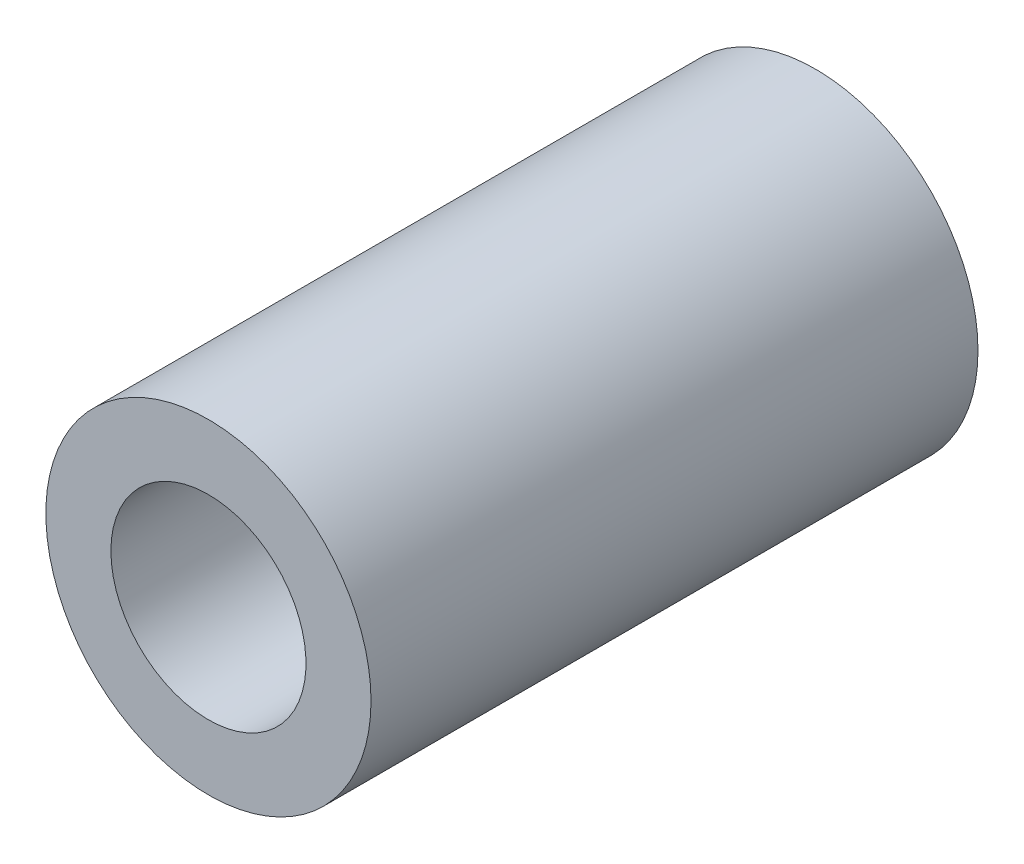
ISO-10303-21;
HEADER;
FILE_DESCRIPTION(('STEP AP214'),'2;1');
FILE_NAME('part.step','',(''),(''),'','','');
FILE_SCHEMA(('AUTOMOTIVE_DESIGN { 1 0 10303 214 1 1 1 1 }'));
ENDSEC;
DATA;
#1=APPLICATION_CONTEXT('core data for automotive mechanical design processes');
#2=APPLICATION_PROTOCOL_DEFINITION('international standard','automotive_design',2000,#1);
#3=PRODUCT_CONTEXT('',#1,'mechanical');
#4=PRODUCT('Part','Part','',(#3));
#5=PRODUCT_RELATED_PRODUCT_CATEGORY('part','',(#4));
#6=PRODUCT_DEFINITION_FORMATION('','',#4);
#7=PRODUCT_DEFINITION_CONTEXT('part definition',#1,'design');
#8=PRODUCT_DEFINITION('design','',#6,#7);
#9=PRODUCT_DEFINITION_SHAPE('','',#8);
#10=(LENGTH_UNIT() NAMED_UNIT(*) SI_UNIT(.MILLI.,.METRE.));
#11=(NAMED_UNIT(*) PLANE_ANGLE_UNIT() SI_UNIT($,.RADIAN.));
#12=(NAMED_UNIT(*) SI_UNIT($,.STERADIAN.) SOLID_ANGLE_UNIT());
#13=UNCERTAINTY_MEASURE_WITH_UNIT(LENGTH_MEASURE(1.E-05),#10,'distance_accuracy_value','');
#14=(GEOMETRIC_REPRESENTATION_CONTEXT(3) GLOBAL_UNCERTAINTY_ASSIGNED_CONTEXT((#13)) GLOBAL_UNIT_ASSIGNED_CONTEXT((#10,
#11,#12)) REPRESENTATION_CONTEXT('',''));
#15=CARTESIAN_POINT('',(0.,0.,0.));
#16=DIRECTION('',(0.,0.,1.));
#17=DIRECTION('',(1.,0.,0.));
#18=AXIS2_PLACEMENT_3D('',#15,#16,#17);
#19=CARTESIAN_POINT('',(-14.5000000000002,-25.1147367097487,49.9999999999545));
#20=DIRECTION('',(0.,0.,1.));
#21=DIRECTION('',(1.,0.,0.));
#22=AXIS2_PLACEMENT_3D('',#19,#20,#21);
#23=CONICAL_SURFACE('',#22,2.50000000000836,0.67474094227567);
#24=CARTESIAN_POINT('',(-14.5000000000002,-25.1147367097487,49.5000000000232));
#25=DIRECTION('',(0.,0.,-1.));
#26=DIRECTION('',(0.500000000007468,-0.866025403780127,0.));
#27=AXIS2_PLACEMENT_3D('',#24,#25,#26);
#28=CIRCLE('',#27,2.09999999995712);
#29=CARTESIAN_POINT('',(-13.450000000006,-26.9333900576498,49.5000000000232));
#30=VERTEX_POINT('',#29);
#31=EDGE_CURVE('E93',#30,#30,#28,.T.);
#32=ORIENTED_EDGE('',*,*,#31,.T.);
#33=EDGE_LOOP('',(#32));
#34=FACE_BOUND('',#33,.T.);
#35=CARTESIAN_POINT('',(-14.5000000000002,-25.1147367097487,49.9999999999545));
#36=DIRECTION('',(0.,0.,-1.));
#37=DIRECTION('',(0.499999999997362,-0.866025403785962,0.));
#38=AXIS2_PLACEMENT_3D('',#35,#36,#37);
#39=CIRCLE('',#38,2.5000000000718);
#40=CARTESIAN_POINT('',(-13.2499999999709,-27.2798002192758,49.9999999999545));
#41=VERTEX_POINT('',#40);
#42=EDGE_CURVE('E88',#41,#41,#39,.F.);
#43=ORIENTED_EDGE('',*,*,#42,.T.);
#44=EDGE_LOOP('',(#43));
#45=FACE_BOUND('',#44,.T.);
#46=ADVANCED_FACE('F15',(#34,#45),#23,.F.);
#47=CARTESIAN_POINT('',(-14.5000000000002,-25.1147367097487,49.000000000035));
#48=DIRECTION('',(0.,0.,-1.));
#49=DIRECTION('',(-1.,0.,0.));
#50=AXIS2_PLACEMENT_3D('',#47,#48,#49);
#51=CONICAL_SURFACE('',#50,2.49999999994492,0.674740942259449);
#52=CARTESIAN_POINT('',(-14.5000000000002,-25.1147367097487,49.000000000035));
#53=DIRECTION('',(0.,0.,1.));
#54=DIRECTION('',(0.499999999998681,-0.8660254037852,0.));
#55=AXIS2_PLACEMENT_3D('',#52,#53,#54);
#56=CIRCLE('',#55,2.50000000000836);
#57=CARTESIAN_POINT('',(-13.2499999999993,-27.2798002192189,49.000000000035));
#58=VERTEX_POINT('',#57);
#59=EDGE_CURVE('E83',#58,#58,#56,.F.);
#60=ORIENTED_EDGE('',*,*,#59,.T.);
#61=EDGE_LOOP('',(#60));
#62=FACE_BOUND('',#61,.T.);
#63=ORIENTED_EDGE('',*,*,#31,.F.);
#64=EDGE_LOOP('',(#63));
#65=FACE_BOUND('',#64,.T.);
#66=ADVANCED_FACE('F100',(#62,#65),#51,.F.);
#67=CARTESIAN_POINT('',(-14.5000000000002,-25.1147367097487,49.9999999999545));
#68=DIRECTION('',(0.,0.,-1.));
#69=DIRECTION('',(-1.,0.,0.));
#70=AXIS2_PLACEMENT_3D('',#67,#68,#69);
#71=CONICAL_SURFACE('',#70,2.5000000000718,0.674740942225901);
#72=ORIENTED_EDGE('',*,*,#42,.F.);
#73=EDGE_LOOP('',(#72));
#74=FACE_BOUND('',#73,.T.);
#75=CARTESIAN_POINT('',(-14.5000000000002,-25.1147367097487,50.4999999999427));
#76=DIRECTION('',(0.,0.,1.));
#77=DIRECTION('',(0.500000000007468,-0.866025403780127,0.));
#78=AXIS2_PLACEMENT_3D('',#75,#76,#77);
#79=CIRCLE('',#78,2.09999999995712);
#80=CARTESIAN_POINT('',(-13.450000000006,-26.9333900576498,50.4999999999427));
#81=VERTEX_POINT('',#80);
#82=EDGE_CURVE('E78',#81,#81,#79,.T.);
#83=ORIENTED_EDGE('',*,*,#82,.T.);
#84=EDGE_LOOP('',(#83));
#85=FACE_BOUND('',#84,.T.);
#86=ADVANCED_FACE('F102',(#74,#85),#71,.F.);
#87=CARTESIAN_POINT('',(-14.5000000000002,-25.1147367097487,48.9999999999213));
#88=DIRECTION('',(0.,0.,1.));
#89=DIRECTION('',(1.,0.,0.));
#90=AXIS2_PLACEMENT_3D('',#87,#88,#89);
#91=CONICAL_SURFACE('',#90,2.49999999994492,0.67474094224212);
#92=CARTESIAN_POINT('',(-14.5000000000002,-25.1147367097487,48.4999999999332));
#93=DIRECTION('',(0.,0.,-1.));
#94=DIRECTION('',(0.500000000005898,-0.866025403781034,0.));
#95=AXIS2_PLACEMENT_3D('',#92,#93,#94);
#96=CIRCLE('',#95,2.10000000002056);
#97=CARTESIAN_POINT('',(-13.4499999999775,-26.9333900577067,48.4999999999332));
#98=VERTEX_POINT('',#97);
#99=EDGE_CURVE('E73',#98,#98,#96,.T.);
#100=ORIENTED_EDGE('',*,*,#99,.T.);
#101=EDGE_LOOP('',(#100));
#102=FACE_BOUND('',#101,.T.);
#103=ORIENTED_EDGE('',*,*,#59,.F.);
#104=EDGE_LOOP('',(#103));
#105=FACE_BOUND('',#104,.T.);
#106=ADVANCED_FACE('F110',(#102,#105),#91,.F.);
#107=CARTESIAN_POINT('',(-14.5000000000002,-25.1147367097487,50.9999999999309));
#108=DIRECTION('',(0.,0.,1.));
#109=DIRECTION('',(1.,0.,0.));
#110=AXIS2_PLACEMENT_3D('',#107,#108,#109);
#111=CONICAL_SURFACE('',#110,2.49999999994492,0.674740942259449);
#112=ORIENTED_EDGE('',*,*,#82,.F.);
#113=EDGE_LOOP('',(#112));
#114=FACE_BOUND('',#113,.T.);
#115=CARTESIAN_POINT('',(-14.5000000000002,-25.1147367097487,50.9999999999309));
#116=DIRECTION('',(0.,0.,-1.));
#117=DIRECTION('',(0.500000000007207,-0.866025403780278,0.));
#118=AXIS2_PLACEMENT_3D('',#115,#116,#117);
#119=CIRCLE('',#118,2.50000000002257);
#120=CARTESIAN_POINT('',(-13.2499999999709,-27.2798002192189,50.9999999999309));
#121=VERTEX_POINT('',#120);
#122=EDGE_CURVE('E68',#121,#121,#119,.F.);
#123=ORIENTED_EDGE('',*,*,#122,.T.);
#124=EDGE_LOOP('',(#123));
#125=FACE_BOUND('',#124,.T.);
#126=ADVANCED_FACE('F162',(#114,#125),#111,.F.);
#127=CARTESIAN_POINT('',(-14.5000000000002,-25.1147367097487,48.0000000000587));
#128=DIRECTION('',(0.,0.,-1.));
#129=DIRECTION('',(-1.,0.,0.));
#130=AXIS2_PLACEMENT_3D('',#127,#128,#129);
#131=CONICAL_SURFACE('',#130,2.49999999989569,0.67474094217751);
#132=CARTESIAN_POINT('',(-14.5000000000002,-25.1147367097487,48.0000000000018));
#133=DIRECTION('',(0.,0.,1.));
#134=DIRECTION('',(0.5,-0.866025403784439,0.));
#135=AXIS2_PLACEMENT_3D('',#132,#133,#134);
#136=CIRCLE('',#135,2.49999999994493);
#137=CARTESIAN_POINT('',(-13.2500000000277,-27.2798002191621,48.0000000000018));
#138=VERTEX_POINT('',#137);
#139=EDGE_CURVE('E63',#138,#138,#136,.F.);
#140=ORIENTED_EDGE('',*,*,#139,.T.);
#141=EDGE_LOOP('',(#140));
#142=FACE_BOUND('',#141,.T.);
#143=ORIENTED_EDGE('',*,*,#99,.F.);
#144=EDGE_LOOP('',(#143));
#145=FACE_BOUND('',#144,.T.);
#146=ADVANCED_FACE('F158',(#142,#145),#131,.F.);
#147=CARTESIAN_POINT('',(-14.5000000000002,-25.1147367097487,50.9999999999309));
#148=DIRECTION('',(0.,0.,-1.));
#149=DIRECTION('',(-1.,0.,0.));
#150=AXIS2_PLACEMENT_3D('',#147,#148,#149);
#151=CONICAL_SURFACE('',#150,2.50000000002257,0.67474094224212);
#152=ORIENTED_EDGE('',*,*,#122,.F.);
#153=EDGE_LOOP('',(#152));
#154=FACE_BOUND('',#153,.T.);
#155=CARTESIAN_POINT('',(-14.5000000000002,-25.1147367097487,51.4999999999759));
#156=DIRECTION('',(0.,0.,1.));
#157=DIRECTION('',(0.499999999997318,-0.866025403785987,0.));
#158=AXIS2_PLACEMENT_3D('',#155,#156,#157);
#159=CIRCLE('',#158,2.09999999994291);
#160=CARTESIAN_POINT('',(-13.4500000000344,-26.9333900576498,51.4999999999759));
#161=VERTEX_POINT('',#160);
#162=EDGE_CURVE('E58',#161,#161,#159,.T.);
#163=ORIENTED_EDGE('',*,*,#162,.T.);
#164=EDGE_LOOP('',(#163));
#165=FACE_BOUND('',#164,.T.);
#166=ADVANCED_FACE('F154',(#154,#165),#151,.F.);
#167=CARTESIAN_POINT('',(-14.5000000000002,-25.1147367097487,48.0000000000018));
#168=DIRECTION('',(0.,0.,1.));
#169=DIRECTION('',(1.,0.,0.));
#170=AXIS2_PLACEMENT_3D('',#167,#168,#169);
#171=CONICAL_SURFACE('',#170,2.49999999994492,0.674740942215636);
#172=CARTESIAN_POINT('',(-14.5000000000002,-25.1147367097487,47.5000000000136));
#173=DIRECTION('',(0.,0.,-1.));
#174=DIRECTION('',(0.499999999995747,-0.866025403786894,0.));
#175=AXIS2_PLACEMENT_3D('',#172,#173,#174);
#176=CIRCLE('',#175,2.10000000000635);
#177=CARTESIAN_POINT('',(-13.450000000006,-26.9333900577067,47.5000000000136));
#178=VERTEX_POINT('',#177);
#179=EDGE_CURVE('E50',#178,#178,#176,.T.);
#180=ORIENTED_EDGE('',*,*,#179,.T.);
#181=EDGE_LOOP('',(#180));
#182=FACE_BOUND('',#181,.T.);
#183=ORIENTED_EDGE('',*,*,#139,.F.);
#184=EDGE_LOOP('',(#183));
#185=FACE_BOUND('',#184,.T.);
#186=ADVANCED_FACE('F150',(#182,#185),#171,.F.);
#187=CARTESIAN_POINT('',(-14.5000000000002,-25.1147367097487,52.0000000000209));
#188=DIRECTION('',(0.,0.,1.));
#189=DIRECTION('',(1.,0.,0.));
#190=AXIS2_PLACEMENT_3D('',#187,#188,#189);
#191=CONICAL_SURFACE('',#190,2.49999999999415,0.67474094224212);
#192=ORIENTED_EDGE('',*,*,#162,.F.);
#193=EDGE_LOOP('',(#192));
#194=FACE_BOUND('',#193,.T.);
#195=CARTESIAN_POINT('',(-14.5000000000002,-25.1147367097487,52.0000000000209));
#196=DIRECTION('',(0.,0.,1.));
#197=DIRECTION('',(1.,0.,0.));
#198=AXIS2_PLACEMENT_3D('',#195,#196,#197);
#199=CIRCLE('',#198,2.49999999999415);
#200=CARTESIAN_POINT('',(-12.0000000000061,-25.1147367097487,52.0000000000209));
#201=VERTEX_POINT('',#200);
#202=EDGE_CURVE('E18',#201,#201,#199,.F.);
#203=ORIENTED_EDGE('',*,*,#202,.F.);
#204=EDGE_LOOP('',(#203));
#205=FACE_BOUND('',#204,.T.);
#206=ADVANCED_FACE('F147',(#194,#205),#191,.F.);
#207=CARTESIAN_POINT('',(-14.5000000000002,-25.1147367097487,46.9999999999686));
#208=DIRECTION('',(0.,0.,-1.));
#209=DIRECTION('',(-1.,0.,0.));
#210=AXIS2_PLACEMENT_3D('',#207,#208,#209);
#211=CONICAL_SURFACE('',#210,2.50000000002257,0.674740942199416);
#212=CARTESIAN_POINT('',(-14.5000000000002,-25.1147367097487,47.0000000000255));
#213=DIRECTION('',(0.,0.,1.));
#214=DIRECTION('',(0.500000000008526,-0.866025403779516,0.));
#215=AXIS2_PLACEMENT_3D('',#212,#213,#214);
#216=CIRCLE('',#215,2.49999999995914);
#217=CARTESIAN_POINT('',(-13.2499999999993,-27.2798002191621,47.0000000000255));
#218=VERTEX_POINT('',#217);
#219=EDGE_CURVE('E40',#218,#218,#216,.F.);
#220=ORIENTED_EDGE('',*,*,#219,.T.);
#221=EDGE_LOOP('',(#220));
#222=FACE_BOUND('',#221,.T.);
#223=ORIENTED_EDGE('',*,*,#179,.F.);
#224=EDGE_LOOP('',(#223));
#225=FACE_BOUND('',#224,.T.);
#226=ADVANCED_FACE('F144',(#222,#225),#211,.F.);
#227=CARTESIAN_POINT('',(-18.3971143170302,-27.3647367097487,52.));
#228=DIRECTION('',(0.,0.,1.));
#229=DIRECTION('',(1.,0.,0.));
#230=AXIS2_PLACEMENT_3D('',#227,#228,#229);
#231=PLANE('',#230);
#232=CARTESIAN_POINT('',(-14.5000000000002,-25.1147367097487,52.));
#233=DIRECTION('',(0.,0.,-1.));
#234=DIRECTION('',(-1.,0.,0.));
#235=AXIS2_PLACEMENT_3D('',#232,#233,#234);
#236=CIRCLE('',#235,4.5);
#237=CARTESIAN_POINT('',(-19.0000000000002,-25.1147367097487,52.));
#238=VERTEX_POINT('',#237);
#239=EDGE_CURVE('E38',#238,#238,#236,.F.);
#240=ORIENTED_EDGE('',*,*,#239,.T.);
#241=EDGE_LOOP('',(#240));
#242=FACE_BOUND('',#241,.T.);
#243=ORIENTED_EDGE('',*,*,#202,.T.);
#244=EDGE_LOOP('',(#243));
#245=FACE_BOUND('',#244,.T.);
#246=ADVANCED_FACE('F140',(#242,#245),#231,.T.);
#247=CARTESIAN_POINT('',(-14.5000000000002,-25.1147367097487,47.0000000000255));
#248=DIRECTION('',(0.,0.,1.));
#249=DIRECTION('',(1.,0.,0.));
#250=AXIS2_PLACEMENT_3D('',#247,#248,#249);
#251=CONICAL_SURFACE('',#250,2.49999999995913,0.674740942160178);
#252=CARTESIAN_POINT('',(-14.5000000000002,-25.1147367097487,46.5000000000373));
#253=DIRECTION('',(0.,0.,-1.));
#254=DIRECTION('',(0.500000000007468,-0.866025403780127,0.));
#255=AXIS2_PLACEMENT_3D('',#252,#253,#254);
#256=CIRCLE('',#255,2.09999999995712);
#257=CARTESIAN_POINT('',(-13.450000000006,-26.9333900576498,46.5000000000373));
#258=VERTEX_POINT('',#257);
#259=EDGE_CURVE('E37',#258,#258,#256,.T.);
#260=ORIENTED_EDGE('',*,*,#259,.T.);
#261=EDGE_LOOP('',(#260));
#262=FACE_BOUND('',#261,.T.);
#263=ORIENTED_EDGE('',*,*,#219,.F.);
#264=EDGE_LOOP('',(#263));
#265=FACE_BOUND('',#264,.T.);
#266=ADVANCED_FACE('F136',(#262,#265),#251,.F.);
#267=CARTESIAN_POINT('',(-14.5000000000002,-25.1147367097487,74.));
#268=DIRECTION('',(0.,0.,-1.));
#269=DIRECTION('',(-1.,0.,0.));
#270=AXIS2_PLACEMENT_3D('',#267,#268,#269);
#271=CYLINDRICAL_SURFACE('',#270,4.5);
#272=CARTESIAN_POINT('',(-14.5000000000002,-25.1147367097487,74.));
#273=DIRECTION('',(0.,0.,-1.));
#274=DIRECTION('',(-1.,0.,0.));
#275=AXIS2_PLACEMENT_3D('',#272,#273,#274);
#276=CIRCLE('',#275,4.5);
#277=CARTESIAN_POINT('',(-19.0000000000002,-25.1147367097487,74.));
#278=VERTEX_POINT('',#277);
#279=EDGE_CURVE('E35',#278,#278,#276,.T.);
#280=ORIENTED_EDGE('',*,*,#279,.F.);
#281=EDGE_LOOP('',(#280));
#282=FACE_BOUND('',#281,.T.);
#283=ORIENTED_EDGE('',*,*,#239,.F.);
#284=EDGE_LOOP('',(#283));
#285=FACE_BOUND('',#284,.T.);
#286=ADVANCED_FACE('F132',(#282,#285),#271,.F.);
#287=CARTESIAN_POINT('',(-14.5000000000002,-25.1147367097487,45.9999999999923));
#288=DIRECTION('',(0.,0.,-1.));
#289=DIRECTION('',(-1.,0.,0.));
#290=AXIS2_PLACEMENT_3D('',#287,#288,#289);
#291=CONICAL_SURFACE('',#290,2.50000000000836,0.67474094224212);
#292=CARTESIAN_POINT('',(-14.5000000000002,-25.1147367097487,45.9999999999923));
#293=DIRECTION('',(0.,0.,-1.));
#294=DIRECTION('',(-1.,0.,0.));
#295=AXIS2_PLACEMENT_3D('',#292,#293,#294);
#296=CIRCLE('',#295,2.50000000000836);
#297=CARTESIAN_POINT('',(-17.0000000000086,-25.1147367097487,45.9999999999923));
#298=VERTEX_POINT('',#297);
#299=EDGE_CURVE('E27',#298,#298,#296,.T.);
#300=ORIENTED_EDGE('',*,*,#299,.T.);
#301=EDGE_LOOP('',(#300));
#302=FACE_BOUND('',#301,.T.);
#303=ORIENTED_EDGE('',*,*,#259,.F.);
#304=EDGE_LOOP('',(#303));
#305=FACE_BOUND('',#304,.T.);
#306=ADVANCED_FACE('F128',(#302,#305),#291,.F.);
#307=CARTESIAN_POINT('',(-20.9951905283835,-28.8647367097487,74.));
#308=DIRECTION('',(0.,0.,1.));
#309=DIRECTION('',(1.,0.,0.));
#310=AXIS2_PLACEMENT_3D('',#307,#308,#309);
#311=PLANE('',#310);
#312=CARTESIAN_POINT('',(-14.5000000000002,-25.1147367097487,74.));
#313=DIRECTION('',(0.,0.,1.));
#314=DIRECTION('',(1.,0.,0.));
#315=AXIS2_PLACEMENT_3D('',#312,#313,#314);
#316=CIRCLE('',#315,7.5);
#317=CARTESIAN_POINT('',(-7.0000000000002,-25.1147367097487,74.));
#318=VERTEX_POINT('',#317);
#319=EDGE_CURVE('E22',#318,#318,#316,.F.);
#320=ORIENTED_EDGE('',*,*,#319,.F.);
#321=EDGE_LOOP('',(#320));
#322=FACE_BOUND('',#321,.T.);
#323=ORIENTED_EDGE('',*,*,#279,.T.);
#324=EDGE_LOOP('',(#323));
#325=FACE_BOUND('',#324,.T.);
#326=ADVANCED_FACE('F121',(#322,#325),#311,.T.);
#327=CARTESIAN_POINT('',(-14.5000000000002,-25.1147367097487,46.));
#328=DIRECTION('',(0.,0.,1.));
#329=DIRECTION('',(1.,0.,0.));
#330=AXIS2_PLACEMENT_3D('',#327,#328,#329);
#331=PLANE('',#330);
#332=CARTESIAN_POINT('',(-14.5000000000002,-25.1147367097487,46.));
#333=DIRECTION('',(0.,0.,1.));
#334=DIRECTION('',(1.,0.,0.));
#335=AXIS2_PLACEMENT_3D('',#332,#333,#334);
#336=CIRCLE('',#335,7.5);
#337=CARTESIAN_POINT('',(-7.0000000000002,-25.1147367097487,46.));
#338=VERTEX_POINT('',#337);
#339=EDGE_CURVE('E10',#338,#338,#336,.T.);
#340=ORIENTED_EDGE('',*,*,#339,.F.);
#341=EDGE_LOOP('',(#340));
#342=FACE_BOUND('',#341,.T.);
#343=ORIENTED_EDGE('',*,*,#299,.F.);
#344=EDGE_LOOP('',(#343));
#345=FACE_BOUND('',#344,.T.);
#346=ADVANCED_FACE('F115',(#342,#345),#331,.F.);
#347=CARTESIAN_POINT('',(-14.5000000000002,-25.1147367097487,46.));
#348=DIRECTION('',(0.,0.,1.));
#349=DIRECTION('',(1.,0.,0.));
#350=AXIS2_PLACEMENT_3D('',#347,#348,#349);
#351=CYLINDRICAL_SURFACE('',#350,7.5);
#352=ORIENTED_EDGE('',*,*,#339,.T.);
#353=EDGE_LOOP('',(#352));
#354=FACE_BOUND('',#353,.T.);
#355=ORIENTED_EDGE('',*,*,#319,.T.);
#356=EDGE_LOOP('',(#355));
#357=FACE_BOUND('',#356,.T.);
#358=ADVANCED_FACE('F113',(#354,#357),#351,.T.);
#359=CLOSED_SHELL('',(#46,#66,#86,#106,#126,#146,#166,#186,#206,#226,#246,#266,#286,#306,#326,
#346,#358));
#360=MANIFOLD_SOLID_BREP('B1',#359);
#361=ADVANCED_BREP_SHAPE_REPRESENTATION('',(#18,#360),#14);
#362=SHAPE_DEFINITION_REPRESENTATION(#9,#361);
ENDSEC;
END-ISO-10303-21;
